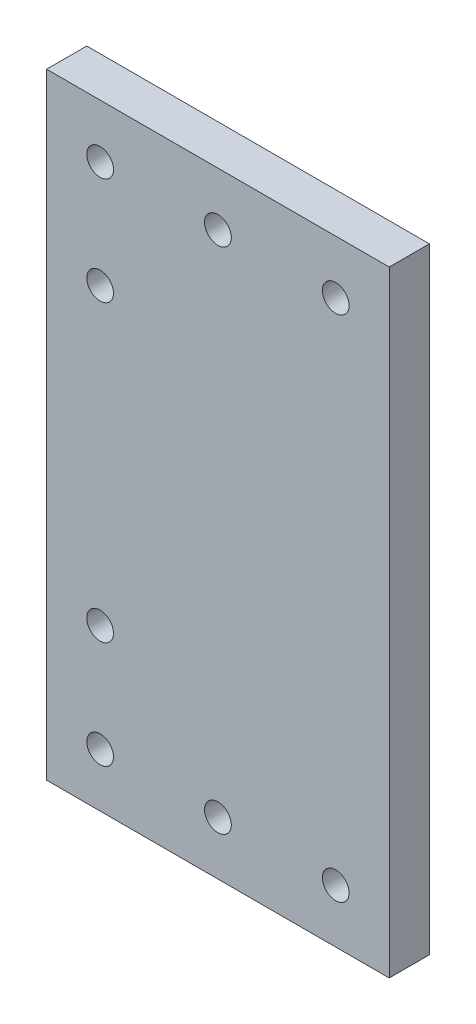
ISO-10303-21;
HEADER;
FILE_DESCRIPTION(('STEP AP214'),'2;1');
FILE_NAME('part.step','',(''),(''),'','','');
FILE_SCHEMA(('AUTOMOTIVE_DESIGN { 1 0 10303 214 1 1 1 1 }'));
ENDSEC;
DATA;
#1=APPLICATION_CONTEXT('core data for automotive mechanical design processes');
#2=APPLICATION_PROTOCOL_DEFINITION('international standard','automotive_design',2000,#1);
#3=PRODUCT_CONTEXT('',#1,'mechanical');
#4=PRODUCT('Part','Part','',(#3));
#5=PRODUCT_RELATED_PRODUCT_CATEGORY('part','',(#4));
#6=PRODUCT_DEFINITION_FORMATION('','',#4);
#7=PRODUCT_DEFINITION_CONTEXT('part definition',#1,'design');
#8=PRODUCT_DEFINITION('design','',#6,#7);
#9=PRODUCT_DEFINITION_SHAPE('','',#8);
#10=(LENGTH_UNIT() NAMED_UNIT(*) SI_UNIT(.MILLI.,.METRE.));
#11=(NAMED_UNIT(*) PLANE_ANGLE_UNIT() SI_UNIT($,.RADIAN.));
#12=(NAMED_UNIT(*) SI_UNIT($,.STERADIAN.) SOLID_ANGLE_UNIT());
#13=UNCERTAINTY_MEASURE_WITH_UNIT(LENGTH_MEASURE(1.E-05),#10,'distance_accuracy_value','');
#14=(GEOMETRIC_REPRESENTATION_CONTEXT(3) GLOBAL_UNCERTAINTY_ASSIGNED_CONTEXT((#13)) GLOBAL_UNIT_ASSIGNED_CONTEXT((#10,
#11,#12)) REPRESENTATION_CONTEXT('',''));
#15=CARTESIAN_POINT('',(0.,0.,0.));
#16=DIRECTION('',(0.,0.,1.));
#17=DIRECTION('',(1.,0.,0.));
#18=AXIS2_PLACEMENT_3D('',#15,#16,#17);
#19=CARTESIAN_POINT('',(-32.,-57.5,3.75));
#20=DIRECTION('',(1.,0.,0.));
#21=DIRECTION('',(0.,0.,-1.));
#22=AXIS2_PLACEMENT_3D('',#19,#20,#21);
#23=PLANE('',#22);
#24=DIRECTION('',(0.,-1.,0.));
#25=VECTOR('',#24,1.);
#26=CARTESIAN_POINT('',(-32.,-57.5,-3.75));
#27=LINE('',#26,#25);
#28=CARTESIAN_POINT('',(-32.,57.5,-3.75));
#29=VERTEX_POINT('',#28);
#30=CARTESIAN_POINT('',(-32.,-57.5,-3.75));
#31=VERTEX_POINT('',#30);
#32=EDGE_CURVE('E99',#29,#31,#27,.T.);
#33=ORIENTED_EDGE('',*,*,#32,.T.);
#34=DIRECTION('',(0.,0.,-1.));
#35=VECTOR('',#34,1.);
#36=CARTESIAN_POINT('',(-32.,-57.5,3.75));
#37=LINE('',#36,#35);
#38=CARTESIAN_POINT('',(-32.,-57.5,3.75));
#39=VERTEX_POINT('',#38);
#40=EDGE_CURVE('E11',#39,#31,#37,.T.);
#41=ORIENTED_EDGE('',*,*,#40,.F.);
#42=DIRECTION('',(0.,-1.,0.));
#43=VECTOR('',#42,1.);
#44=CARTESIAN_POINT('',(-32.,-57.5,3.75));
#45=LINE('',#44,#43);
#46=CARTESIAN_POINT('',(-32.,57.5,3.75));
#47=VERTEX_POINT('',#46);
#48=EDGE_CURVE('E87',#47,#39,#45,.T.);
#49=ORIENTED_EDGE('',*,*,#48,.F.);
#50=DIRECTION('',(0.,0.,-1.));
#51=VECTOR('',#50,1.);
#52=CARTESIAN_POINT('',(-32.,57.5,3.75));
#53=LINE('',#52,#51);
#54=EDGE_CURVE('E95',#47,#29,#53,.T.);
#55=ORIENTED_EDGE('',*,*,#54,.T.);
#56=EDGE_LOOP('',(#33,#41,#49,#55));
#57=FACE_BOUND('',#56,.T.);
#58=ADVANCED_FACE('F36',(#57),#23,.F.);
#59=CARTESIAN_POINT('',(32.,-57.5,3.75));
#60=DIRECTION('',(0.,1.,0.));
#61=DIRECTION('',(-1.,0.,0.));
#62=AXIS2_PLACEMENT_3D('',#59,#60,#61);
#63=PLANE('',#62);
#64=DIRECTION('',(1.,0.,0.));
#65=VECTOR('',#64,1.);
#66=CARTESIAN_POINT('',(32.,-57.5,-3.75));
#67=LINE('',#66,#65);
#68=CARTESIAN_POINT('',(32.,-57.5,-3.75));
#69=VERTEX_POINT('',#68);
#70=EDGE_CURVE('E91',#31,#69,#67,.T.);
#71=ORIENTED_EDGE('',*,*,#70,.T.);
#72=DIRECTION('',(0.,0.,-1.));
#73=VECTOR('',#72,1.);
#74=CARTESIAN_POINT('',(32.,-57.5,3.75));
#75=LINE('',#74,#73);
#76=CARTESIAN_POINT('',(32.,-57.5,3.75));
#77=VERTEX_POINT('',#76);
#78=EDGE_CURVE('E44',#77,#69,#75,.T.);
#79=ORIENTED_EDGE('',*,*,#78,.F.);
#80=DIRECTION('',(1.,0.,0.));
#81=VECTOR('',#80,1.);
#82=CARTESIAN_POINT('',(32.,-57.5,3.75));
#83=LINE('',#82,#81);
#84=EDGE_CURVE('E82',#39,#77,#83,.T.);
#85=ORIENTED_EDGE('',*,*,#84,.F.);
#86=ORIENTED_EDGE('',*,*,#40,.T.);
#87=EDGE_LOOP('',(#71,#79,#85,#86));
#88=FACE_BOUND('',#87,.T.);
#89=ADVANCED_FACE('F90',(#88),#63,.F.);
#90=CARTESIAN_POINT('',(32.,-57.5,3.75));
#91=DIRECTION('',(-1.,0.,0.));
#92=DIRECTION('',(0.,0.,1.));
#93=AXIS2_PLACEMENT_3D('',#90,#91,#92);
#94=PLANE('',#93);
#95=DIRECTION('',(0.,1.,0.));
#96=VECTOR('',#95,1.);
#97=CARTESIAN_POINT('',(32.,-57.5,-3.75));
#98=LINE('',#97,#96);
#99=CARTESIAN_POINT('',(32.,57.5,-3.75));
#100=VERTEX_POINT('',#99);
#101=EDGE_CURVE('E69',#69,#100,#98,.T.);
#102=ORIENTED_EDGE('',*,*,#101,.T.);
#103=DIRECTION('',(0.,0.,-1.));
#104=VECTOR('',#103,1.);
#105=CARTESIAN_POINT('',(32.,57.5,3.75));
#106=LINE('',#105,#104);
#107=CARTESIAN_POINT('',(32.,57.5,3.75));
#108=VERTEX_POINT('',#107);
#109=EDGE_CURVE('E92',#108,#100,#106,.T.);
#110=ORIENTED_EDGE('',*,*,#109,.F.);
#111=DIRECTION('',(0.,1.,0.));
#112=VECTOR('',#111,1.);
#113=CARTESIAN_POINT('',(32.,-57.5,3.75));
#114=LINE('',#113,#112);
#115=EDGE_CURVE('E85',#77,#108,#114,.T.);
#116=ORIENTED_EDGE('',*,*,#115,.F.);
#117=ORIENTED_EDGE('',*,*,#78,.T.);
#118=EDGE_LOOP('',(#102,#110,#116,#117));
#119=FACE_BOUND('',#118,.T.);
#120=ADVANCED_FACE('F93',(#119),#94,.F.);
#121=CARTESIAN_POINT('',(32.,57.5,3.75));
#122=DIRECTION('',(0.,-1.,0.));
#123=DIRECTION('',(0.,0.,-1.));
#124=AXIS2_PLACEMENT_3D('',#121,#122,#123);
#125=PLANE('',#124);
#126=DIRECTION('',(-1.,0.,0.));
#127=VECTOR('',#126,1.);
#128=CARTESIAN_POINT('',(32.,57.5,-3.75));
#129=LINE('',#128,#127);
#130=EDGE_CURVE('E75',#100,#29,#129,.T.);
#131=ORIENTED_EDGE('',*,*,#130,.T.);
#132=ORIENTED_EDGE('',*,*,#54,.F.);
#133=DIRECTION('',(-1.,0.,0.));
#134=VECTOR('',#133,1.);
#135=CARTESIAN_POINT('',(32.,57.5,3.75));
#136=LINE('',#135,#134);
#137=EDGE_CURVE('E52',#108,#47,#136,.T.);
#138=ORIENTED_EDGE('',*,*,#137,.F.);
#139=ORIENTED_EDGE('',*,*,#109,.T.);
#140=EDGE_LOOP('',(#131,#132,#138,#139));
#141=FACE_BOUND('',#140,.T.);
#142=ADVANCED_FACE('F107',(#141),#125,.F.);
#143=CARTESIAN_POINT('',(0.,0.,3.75));
#144=DIRECTION('',(0.,0.,1.));
#145=DIRECTION('',(1.,0.,0.));
#146=AXIS2_PLACEMENT_3D('',#143,#144,#145);
#147=PLANE('',#146);
#148=CARTESIAN_POINT('',(-22.,-27.5,3.75));
#149=DIRECTION('',(0.,0.,1.));
#150=DIRECTION('',(1.,0.,0.));
#151=AXIS2_PLACEMENT_3D('',#148,#149,#150);
#152=CIRCLE('',#151,2.5);
#153=CARTESIAN_POINT('',(-19.5,-27.5,3.75));
#154=VERTEX_POINT('',#153);
#155=EDGE_CURVE('E132',#154,#154,#152,.F.);
#156=ORIENTED_EDGE('',*,*,#155,.T.);
#157=EDGE_LOOP('',(#156));
#158=FACE_BOUND('',#157,.T.);
#159=CARTESIAN_POINT('',(22.,-47.5,3.75));
#160=DIRECTION('',(0.,0.,1.));
#161=DIRECTION('',(1.,0.,0.));
#162=AXIS2_PLACEMENT_3D('',#159,#160,#161);
#163=CIRCLE('',#162,2.5);
#164=CARTESIAN_POINT('',(24.5,-47.5,3.75));
#165=VERTEX_POINT('',#164);
#166=EDGE_CURVE('E139',#165,#165,#163,.F.);
#167=ORIENTED_EDGE('',*,*,#166,.T.);
#168=EDGE_LOOP('',(#167));
#169=FACE_BOUND('',#168,.T.);
#170=CARTESIAN_POINT('',(0.,-47.5,3.75));
#171=DIRECTION('',(0.,0.,1.));
#172=DIRECTION('',(1.,0.,0.));
#173=AXIS2_PLACEMENT_3D('',#170,#171,#172);
#174=CIRCLE('',#173,2.5);
#175=CARTESIAN_POINT('',(2.49999999999999,-47.5,3.75));
#176=VERTEX_POINT('',#175);
#177=EDGE_CURVE('E142',#176,#176,#174,.F.);
#178=ORIENTED_EDGE('',*,*,#177,.T.);
#179=EDGE_LOOP('',(#178));
#180=FACE_BOUND('',#179,.T.);
#181=CARTESIAN_POINT('',(-22.,-47.5,3.75));
#182=DIRECTION('',(0.,0.,1.));
#183=DIRECTION('',(1.,0.,0.));
#184=AXIS2_PLACEMENT_3D('',#181,#182,#183);
#185=CIRCLE('',#184,2.5);
#186=CARTESIAN_POINT('',(-19.5,-47.5,3.75));
#187=VERTEX_POINT('',#186);
#188=EDGE_CURVE('E145',#187,#187,#185,.F.);
#189=ORIENTED_EDGE('',*,*,#188,.T.);
#190=EDGE_LOOP('',(#189));
#191=FACE_BOUND('',#190,.T.);
#192=CARTESIAN_POINT('',(-22.,27.5,3.75));
#193=DIRECTION('',(0.,0.,1.));
#194=DIRECTION('',(1.,0.,0.));
#195=AXIS2_PLACEMENT_3D('',#192,#193,#194);
#196=CIRCLE('',#195,2.5);
#197=CARTESIAN_POINT('',(-19.5,27.5,3.75));
#198=VERTEX_POINT('',#197);
#199=EDGE_CURVE('E102',#198,#198,#196,.T.);
#200=ORIENTED_EDGE('',*,*,#199,.F.);
#201=EDGE_LOOP('',(#200));
#202=FACE_BOUND('',#201,.T.);
#203=CARTESIAN_POINT('',(22.,47.5,3.75));
#204=DIRECTION('',(0.,0.,1.));
#205=DIRECTION('',(1.,0.,0.));
#206=AXIS2_PLACEMENT_3D('',#203,#204,#205);
#207=CIRCLE('',#206,2.5);
#208=CARTESIAN_POINT('',(24.5,47.5,3.75));
#209=VERTEX_POINT('',#208);
#210=EDGE_CURVE('E115',#209,#209,#207,.T.);
#211=ORIENTED_EDGE('',*,*,#210,.F.);
#212=EDGE_LOOP('',(#211));
#213=FACE_BOUND('',#212,.T.);
#214=CARTESIAN_POINT('',(0.,47.5,3.75));
#215=DIRECTION('',(0.,0.,1.));
#216=DIRECTION('',(1.,0.,0.));
#217=AXIS2_PLACEMENT_3D('',#214,#215,#216);
#218=CIRCLE('',#217,2.5);
#219=CARTESIAN_POINT('',(2.49999999999999,47.5,3.75));
#220=VERTEX_POINT('',#219);
#221=EDGE_CURVE('E118',#220,#220,#218,.T.);
#222=ORIENTED_EDGE('',*,*,#221,.F.);
#223=EDGE_LOOP('',(#222));
#224=FACE_BOUND('',#223,.T.);
#225=CARTESIAN_POINT('',(-22.,47.5,3.75));
#226=DIRECTION('',(0.,0.,1.));
#227=DIRECTION('',(1.,0.,0.));
#228=AXIS2_PLACEMENT_3D('',#225,#226,#227);
#229=CIRCLE('',#228,2.5);
#230=CARTESIAN_POINT('',(-19.5,47.5,3.75));
#231=VERTEX_POINT('',#230);
#232=EDGE_CURVE('E121',#231,#231,#229,.T.);
#233=ORIENTED_EDGE('',*,*,#232,.F.);
#234=EDGE_LOOP('',(#233));
#235=FACE_BOUND('',#234,.T.);
#236=ORIENTED_EDGE('',*,*,#48,.T.);
#237=ORIENTED_EDGE('',*,*,#84,.T.);
#238=ORIENTED_EDGE('',*,*,#115,.T.);
#239=ORIENTED_EDGE('',*,*,#137,.T.);
#240=EDGE_LOOP('',(#236,#237,#238,#239));
#241=FACE_BOUND('',#240,.T.);
#242=ADVANCED_FACE('F83',(#158,#169,#180,#191,#202,#213,#224,#235,#241),#147,.T.);
#243=CARTESIAN_POINT('',(0.,0.,-3.75));
#244=DIRECTION('',(0.,0.,1.));
#245=DIRECTION('',(1.,0.,0.));
#246=AXIS2_PLACEMENT_3D('',#243,#244,#245);
#247=PLANE('',#246);
#248=CARTESIAN_POINT('',(-22.,-27.5,-3.75));
#249=DIRECTION('',(0.,0.,-1.));
#250=DIRECTION('',(1.,0.,0.));
#251=AXIS2_PLACEMENT_3D('',#248,#249,#250);
#252=CIRCLE('',#251,2.5);
#253=CARTESIAN_POINT('',(-19.5,-27.5,-3.75));
#254=VERTEX_POINT('',#253);
#255=EDGE_CURVE('E152',#254,#254,#252,.T.);
#256=ORIENTED_EDGE('',*,*,#255,.F.);
#257=EDGE_LOOP('',(#256));
#258=FACE_BOUND('',#257,.T.);
#259=CARTESIAN_POINT('',(22.,-47.5,-3.75));
#260=DIRECTION('',(0.,0.,-1.));
#261=DIRECTION('',(1.,0.,0.));
#262=AXIS2_PLACEMENT_3D('',#259,#260,#261);
#263=CIRCLE('',#262,2.5);
#264=CARTESIAN_POINT('',(24.5,-47.5,-3.75));
#265=VERTEX_POINT('',#264);
#266=EDGE_CURVE('E155',#265,#265,#263,.T.);
#267=ORIENTED_EDGE('',*,*,#266,.F.);
#268=EDGE_LOOP('',(#267));
#269=FACE_BOUND('',#268,.T.);
#270=CARTESIAN_POINT('',(0.,-47.5,-3.75));
#271=DIRECTION('',(0.,0.,-1.));
#272=DIRECTION('',(1.,0.,0.));
#273=AXIS2_PLACEMENT_3D('',#270,#271,#272);
#274=CIRCLE('',#273,2.5);
#275=CARTESIAN_POINT('',(2.49999999999999,-47.5,-3.75));
#276=VERTEX_POINT('',#275);
#277=EDGE_CURVE('E151',#276,#276,#274,.T.);
#278=ORIENTED_EDGE('',*,*,#277,.F.);
#279=EDGE_LOOP('',(#278));
#280=FACE_BOUND('',#279,.T.);
#281=CARTESIAN_POINT('',(-22.,-47.5,-3.75));
#282=DIRECTION('',(0.,0.,-1.));
#283=DIRECTION('',(1.,0.,0.));
#284=AXIS2_PLACEMENT_3D('',#281,#282,#283);
#285=CIRCLE('',#284,2.5);
#286=CARTESIAN_POINT('',(-19.5,-47.5,-3.75));
#287=VERTEX_POINT('',#286);
#288=EDGE_CURVE('E148',#287,#287,#285,.T.);
#289=ORIENTED_EDGE('',*,*,#288,.F.);
#290=EDGE_LOOP('',(#289));
#291=FACE_BOUND('',#290,.T.);
#292=CARTESIAN_POINT('',(-22.,27.5,-3.75));
#293=DIRECTION('',(0.,0.,1.));
#294=DIRECTION('',(1.,0.,0.));
#295=AXIS2_PLACEMENT_3D('',#292,#293,#294);
#296=CIRCLE('',#295,2.5);
#297=CARTESIAN_POINT('',(-19.5,27.5,-3.75));
#298=VERTEX_POINT('',#297);
#299=EDGE_CURVE('E128',#298,#298,#296,.T.);
#300=ORIENTED_EDGE('',*,*,#299,.T.);
#301=EDGE_LOOP('',(#300));
#302=FACE_BOUND('',#301,.T.);
#303=CARTESIAN_POINT('',(22.,47.5,-3.75));
#304=DIRECTION('',(0.,0.,1.));
#305=DIRECTION('',(1.,0.,0.));
#306=AXIS2_PLACEMENT_3D('',#303,#304,#305);
#307=CIRCLE('',#306,2.5);
#308=CARTESIAN_POINT('',(24.5,47.5,-3.75));
#309=VERTEX_POINT('',#308);
#310=EDGE_CURVE('E131',#309,#309,#307,.T.);
#311=ORIENTED_EDGE('',*,*,#310,.T.);
#312=EDGE_LOOP('',(#311));
#313=FACE_BOUND('',#312,.T.);
#314=CARTESIAN_POINT('',(0.,47.5,-3.75));
#315=DIRECTION('',(0.,0.,1.));
#316=DIRECTION('',(1.,0.,0.));
#317=AXIS2_PLACEMENT_3D('',#314,#315,#316);
#318=CIRCLE('',#317,2.5);
#319=CARTESIAN_POINT('',(2.49999999999999,47.5,-3.75));
#320=VERTEX_POINT('',#319);
#321=EDGE_CURVE('E127',#320,#320,#318,.T.);
#322=ORIENTED_EDGE('',*,*,#321,.T.);
#323=EDGE_LOOP('',(#322));
#324=FACE_BOUND('',#323,.T.);
#325=CARTESIAN_POINT('',(-22.,47.5,-3.75));
#326=DIRECTION('',(0.,0.,1.));
#327=DIRECTION('',(1.,0.,0.));
#328=AXIS2_PLACEMENT_3D('',#325,#326,#327);
#329=CIRCLE('',#328,2.5);
#330=CARTESIAN_POINT('',(-19.5,47.5,-3.75));
#331=VERTEX_POINT('',#330);
#332=EDGE_CURVE('E124',#331,#331,#329,.T.);
#333=ORIENTED_EDGE('',*,*,#332,.T.);
#334=EDGE_LOOP('',(#333));
#335=FACE_BOUND('',#334,.T.);
#336=ORIENTED_EDGE('',*,*,#32,.F.);
#337=ORIENTED_EDGE('',*,*,#130,.F.);
#338=ORIENTED_EDGE('',*,*,#101,.F.);
#339=ORIENTED_EDGE('',*,*,#70,.F.);
#340=EDGE_LOOP('',(#336,#337,#338,#339));
#341=FACE_BOUND('',#340,.T.);
#342=ADVANCED_FACE('F110',(#258,#269,#280,#291,#302,#313,#324,#335,#341),#247,.F.);
#343=CARTESIAN_POINT('',(-22.,47.5,-3.75));
#344=DIRECTION('',(0.,0.,1.));
#345=DIRECTION('',(1.,0.,0.));
#346=AXIS2_PLACEMENT_3D('',#343,#344,#345);
#347=CYLINDRICAL_SURFACE('',#346,2.5);
#348=ORIENTED_EDGE('',*,*,#232,.T.);
#349=EDGE_LOOP('',(#348));
#350=FACE_BOUND('',#349,.T.);
#351=ORIENTED_EDGE('',*,*,#332,.F.);
#352=EDGE_LOOP('',(#351));
#353=FACE_BOUND('',#352,.T.);
#354=ADVANCED_FACE('F165',(#350,#353),#347,.F.);
#355=CARTESIAN_POINT('',(0.,47.5,-3.75));
#356=DIRECTION('',(0.,0.,1.));
#357=DIRECTION('',(1.,0.,0.));
#358=AXIS2_PLACEMENT_3D('',#355,#356,#357);
#359=CYLINDRICAL_SURFACE('',#358,2.5);
#360=ORIENTED_EDGE('',*,*,#221,.T.);
#361=EDGE_LOOP('',(#360));
#362=FACE_BOUND('',#361,.T.);
#363=ORIENTED_EDGE('',*,*,#321,.F.);
#364=EDGE_LOOP('',(#363));
#365=FACE_BOUND('',#364,.T.);
#366=ADVANCED_FACE('F179',(#362,#365),#359,.F.);
#367=CARTESIAN_POINT('',(22.,47.5,-3.75));
#368=DIRECTION('',(0.,0.,1.));
#369=DIRECTION('',(1.,0.,0.));
#370=AXIS2_PLACEMENT_3D('',#367,#368,#369);
#371=CYLINDRICAL_SURFACE('',#370,2.5);
#372=ORIENTED_EDGE('',*,*,#210,.T.);
#373=EDGE_LOOP('',(#372));
#374=FACE_BOUND('',#373,.T.);
#375=ORIENTED_EDGE('',*,*,#310,.F.);
#376=EDGE_LOOP('',(#375));
#377=FACE_BOUND('',#376,.T.);
#378=ADVANCED_FACE('F185',(#374,#377),#371,.F.);
#379=CARTESIAN_POINT('',(-22.,27.5,-3.75));
#380=DIRECTION('',(0.,0.,1.));
#381=DIRECTION('',(1.,0.,0.));
#382=AXIS2_PLACEMENT_3D('',#379,#380,#381);
#383=CYLINDRICAL_SURFACE('',#382,2.5);
#384=ORIENTED_EDGE('',*,*,#199,.T.);
#385=EDGE_LOOP('',(#384));
#386=FACE_BOUND('',#385,.T.);
#387=ORIENTED_EDGE('',*,*,#299,.F.);
#388=EDGE_LOOP('',(#387));
#389=FACE_BOUND('',#388,.T.);
#390=ADVANCED_FACE('F223',(#386,#389),#383,.F.);
#391=CARTESIAN_POINT('',(-22.,-47.5,-3.75));
#392=DIRECTION('',(0.,0.,1.));
#393=DIRECTION('',(1.,0.,0.));
#394=AXIS2_PLACEMENT_3D('',#391,#392,#393);
#395=CYLINDRICAL_SURFACE('',#394,2.5);
#396=ORIENTED_EDGE('',*,*,#188,.F.);
#397=EDGE_LOOP('',(#396));
#398=FACE_BOUND('',#397,.T.);
#399=ORIENTED_EDGE('',*,*,#288,.T.);
#400=EDGE_LOOP('',(#399));
#401=FACE_BOUND('',#400,.T.);
#402=ADVANCED_FACE('F228',(#398,#401),#395,.F.);
#403=CARTESIAN_POINT('',(0.,-47.5,-3.75));
#404=DIRECTION('',(0.,0.,1.));
#405=DIRECTION('',(1.,0.,0.));
#406=AXIS2_PLACEMENT_3D('',#403,#404,#405);
#407=CYLINDRICAL_SURFACE('',#406,2.5);
#408=ORIENTED_EDGE('',*,*,#177,.F.);
#409=EDGE_LOOP('',(#408));
#410=FACE_BOUND('',#409,.T.);
#411=ORIENTED_EDGE('',*,*,#277,.T.);
#412=EDGE_LOOP('',(#411));
#413=FACE_BOUND('',#412,.T.);
#414=ADVANCED_FACE('F161',(#410,#413),#407,.F.);
#415=CARTESIAN_POINT('',(22.,-47.5,-3.75));
#416=DIRECTION('',(0.,0.,1.));
#417=DIRECTION('',(1.,0.,0.));
#418=AXIS2_PLACEMENT_3D('',#415,#416,#417);
#419=CYLINDRICAL_SURFACE('',#418,2.5);
#420=ORIENTED_EDGE('',*,*,#166,.F.);
#421=EDGE_LOOP('',(#420));
#422=FACE_BOUND('',#421,.T.);
#423=ORIENTED_EDGE('',*,*,#266,.T.);
#424=EDGE_LOOP('',(#423));
#425=FACE_BOUND('',#424,.T.);
#426=ADVANCED_FACE('F237',(#422,#425),#419,.F.);
#427=CARTESIAN_POINT('',(-22.,-27.5,-3.75));
#428=DIRECTION('',(0.,0.,1.));
#429=DIRECTION('',(1.,0.,0.));
#430=AXIS2_PLACEMENT_3D('',#427,#428,#429);
#431=CYLINDRICAL_SURFACE('',#430,2.5);
#432=ORIENTED_EDGE('',*,*,#155,.F.);
#433=EDGE_LOOP('',(#432));
#434=FACE_BOUND('',#433,.T.);
#435=ORIENTED_EDGE('',*,*,#255,.T.);
#436=EDGE_LOOP('',(#435));
#437=FACE_BOUND('',#436,.T.);
#438=ADVANCED_FACE('F234',(#434,#437),#431,.F.);
#439=CLOSED_SHELL('',(#58,#89,#120,#142,#242,#342,#354,#366,#378,#390,#402,#414,#426,#438));
#440=MANIFOLD_SOLID_BREP('B2',#439);
#441=ADVANCED_BREP_SHAPE_REPRESENTATION('',(#18,#440),#14);
#442=SHAPE_DEFINITION_REPRESENTATION(#9,#441);
ENDSEC;
END-ISO-10303-21;
